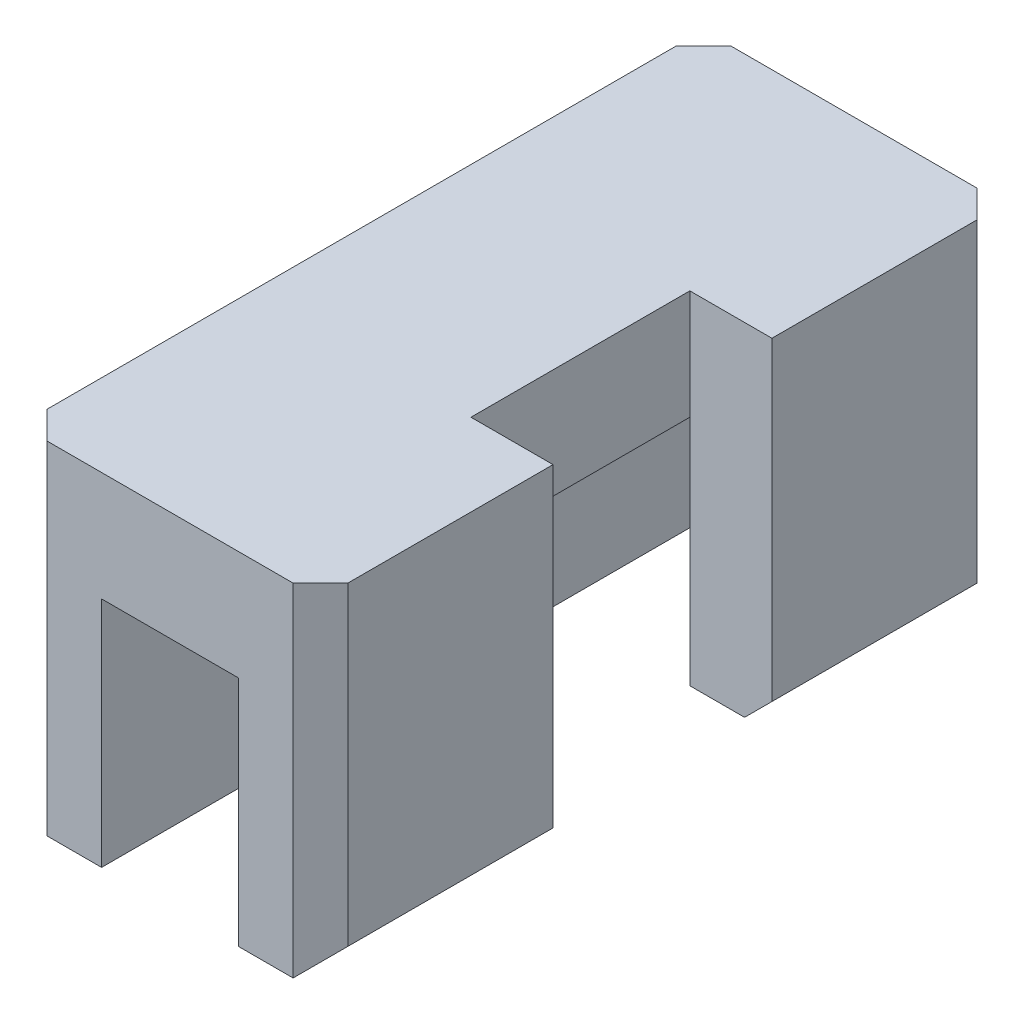
ISO-10303-21;
HEADER;
FILE_DESCRIPTION(('STEP AP214'),'2;1');
FILE_NAME('part.step','',(''),(''),'','','');
FILE_SCHEMA(('AUTOMOTIVE_DESIGN { 1 0 10303 214 1 1 1 1 }'));
ENDSEC;
DATA;
#1=APPLICATION_CONTEXT('core data for automotive mechanical design processes');
#2=APPLICATION_PROTOCOL_DEFINITION('international standard','automotive_design',2000,#1);
#3=PRODUCT_CONTEXT('',#1,'mechanical');
#4=PRODUCT('Part','Part','',(#3));
#5=PRODUCT_RELATED_PRODUCT_CATEGORY('part','',(#4));
#6=PRODUCT_DEFINITION_FORMATION('','',#4);
#7=PRODUCT_DEFINITION_CONTEXT('part definition',#1,'design');
#8=PRODUCT_DEFINITION('design','',#6,#7);
#9=PRODUCT_DEFINITION_SHAPE('','',#8);
#10=(LENGTH_UNIT() NAMED_UNIT(*) SI_UNIT(.MILLI.,.METRE.));
#11=(NAMED_UNIT(*) PLANE_ANGLE_UNIT() SI_UNIT($,.RADIAN.));
#12=(NAMED_UNIT(*) SI_UNIT($,.STERADIAN.) SOLID_ANGLE_UNIT());
#13=UNCERTAINTY_MEASURE_WITH_UNIT(LENGTH_MEASURE(1.E-05),#10,'distance_accuracy_value','');
#14=(GEOMETRIC_REPRESENTATION_CONTEXT(3) GLOBAL_UNCERTAINTY_ASSIGNED_CONTEXT((#13)) GLOBAL_UNIT_ASSIGNED_CONTEXT((#10,
#11,#12)) REPRESENTATION_CONTEXT('',''));
#15=CARTESIAN_POINT('',(0.,0.,0.));
#16=DIRECTION('',(0.,0.,1.));
#17=DIRECTION('',(1.,0.,0.));
#18=AXIS2_PLACEMENT_3D('',#15,#16,#17);
#19=CARTESIAN_POINT('',(5.,-17.,50.));
#20=DIRECTION('',(1.,0.,0.));
#21=DIRECTION('',(0.,1.,0.));
#22=AXIS2_PLACEMENT_3D('',#19,#20,#21);
#23=PLANE('',#22);
#24=DIRECTION('',(0.,0.,-1.));
#25=VECTOR('',#24,1.);
#26=CARTESIAN_POINT('',(5.,-17.,50.));
#27=LINE('',#26,#25);
#28=CARTESIAN_POINT('',(5.00000000000001,-17.,17.));
#29=VERTEX_POINT('',#28);
#30=CARTESIAN_POINT('',(5.,-17.,0.));
#31=VERTEX_POINT('',#30);
#32=EDGE_CURVE('E256',#29,#31,#27,.T.);
#33=ORIENTED_EDGE('',*,*,#32,.F.);
#34=DIRECTION('',(0.,1.,0.));
#35=VECTOR('',#34,1.);
#36=CARTESIAN_POINT('',(5.00000000000001,-17.,17.));
#37=LINE('',#36,#35);
#38=CARTESIAN_POINT('',(5.,0.,17.));
#39=VERTEX_POINT('',#38);
#40=EDGE_CURVE('E177',#29,#39,#37,.T.);
#41=ORIENTED_EDGE('',*,*,#40,.T.);
#42=DIRECTION('',(0.,0.,-1.));
#43=VECTOR('',#42,1.);
#44=CARTESIAN_POINT('',(5.,0.,50.));
#45=LINE('',#44,#43);
#46=CARTESIAN_POINT('',(5.,0.,0.));
#47=VERTEX_POINT('',#46);
#48=EDGE_CURVE('E226',#39,#47,#45,.T.);
#49=ORIENTED_EDGE('',*,*,#48,.T.);
#50=DIRECTION('',(0.,-1.,0.));
#51=VECTOR('',#50,1.);
#52=CARTESIAN_POINT('',(5.,-17.,0.));
#53=LINE('',#52,#51);
#54=EDGE_CURVE('E206',#47,#31,#53,.T.);
#55=ORIENTED_EDGE('',*,*,#54,.T.);
#56=EDGE_LOOP('',(#33,#41,#49,#55));
#57=FACE_BOUND('',#56,.T.);
#58=ADVANCED_FACE('F39',(#57),#23,.F.);
#59=CARTESIAN_POINT('',(11.,-17.,50.));
#60=DIRECTION('',(0.,1.,0.));
#61=DIRECTION('',(-1.,0.,0.));
#62=AXIS2_PLACEMENT_3D('',#59,#60,#61);
#63=PLANE('',#62);
#64=DIRECTION('',(1.,0.,0.));
#65=VECTOR('',#64,1.);
#66=CARTESIAN_POINT('',(11.,-17.,0.));
#67=LINE('',#66,#65);
#68=CARTESIAN_POINT('',(8.99999999999999,-17.,0.));
#69=VERTEX_POINT('',#68);
#70=EDGE_CURVE('E229',#31,#69,#67,.T.);
#71=ORIENTED_EDGE('',*,*,#70,.T.);
#72=DIRECTION('',(0.,0.,1.));
#73=VECTOR('',#72,1.);
#74=CARTESIAN_POINT('',(8.99999999999999,-17.,50.));
#75=LINE('',#74,#73);
#76=CARTESIAN_POINT('',(8.99999999999999,-17.,17.));
#77=VERTEX_POINT('',#76);
#78=EDGE_CURVE('E290',#69,#77,#75,.T.);
#79=ORIENTED_EDGE('',*,*,#78,.T.);
#80=DIRECTION('',(1.,0.,0.));
#81=VECTOR('',#80,1.);
#82=CARTESIAN_POINT('',(5.00000000000001,-17.,17.));
#83=LINE('',#82,#81);
#84=EDGE_CURVE('E204',#29,#77,#83,.T.);
#85=ORIENTED_EDGE('',*,*,#84,.F.);
#86=ORIENTED_EDGE('',*,*,#32,.T.);
#87=EDGE_LOOP('',(#71,#79,#85,#86));
#88=FACE_BOUND('',#87,.T.);
#89=ADVANCED_FACE('F362',(#88),#63,.F.);
#90=CARTESIAN_POINT('',(11.,8.,50.));
#91=DIRECTION('',(-1.,0.,0.));
#92=DIRECTION('',(0.,-1.,0.));
#93=AXIS2_PLACEMENT_3D('',#90,#91,#92);
#94=PLANE('',#93);
#95=DIRECTION('',(0.,0.,-1.));
#96=VECTOR('',#95,1.);
#97=CARTESIAN_POINT('',(11.,-15.,50.));
#98=LINE('',#97,#96);
#99=CARTESIAN_POINT('',(11.,-15.,17.));
#100=VERTEX_POINT('',#99);
#101=CARTESIAN_POINT('',(11.,-15.,2.));
#102=VERTEX_POINT('',#101);
#103=EDGE_CURVE('E285',#100,#102,#98,.T.);
#104=ORIENTED_EDGE('',*,*,#103,.T.);
#105=DIRECTION('',(0.,1.,0.));
#106=VECTOR('',#105,1.);
#107=CARTESIAN_POINT('',(11.,8.,2.));
#108=LINE('',#107,#106);
#109=CARTESIAN_POINT('',(11.,8.,2.));
#110=VERTEX_POINT('',#109);
#111=EDGE_CURVE('E287',#102,#110,#108,.T.);
#112=ORIENTED_EDGE('',*,*,#111,.T.);
#113=DIRECTION('',(0.,0.,-1.));
#114=VECTOR('',#113,1.);
#115=CARTESIAN_POINT('',(11.,8.,50.));
#116=LINE('',#115,#114);
#117=CARTESIAN_POINT('',(11.,8.,17.));
#118=VERTEX_POINT('',#117);
#119=EDGE_CURVE('E253',#118,#110,#116,.T.);
#120=ORIENTED_EDGE('',*,*,#119,.F.);
#121=DIRECTION('',(0.,1.,0.));
#122=VECTOR('',#121,1.);
#123=CARTESIAN_POINT('',(11.,-17.,17.));
#124=LINE('',#123,#122);
#125=EDGE_CURVE('E185',#100,#118,#124,.T.);
#126=ORIENTED_EDGE('',*,*,#125,.F.);
#127=EDGE_LOOP('',(#104,#112,#120,#126));
#128=FACE_BOUND('',#127,.T.);
#129=ADVANCED_FACE('F354',(#128),#94,.F.);
#130=CARTESIAN_POINT('',(5.,0.,50.));
#131=VERTEX_POINT('',#130);
#132=CARTESIAN_POINT('',(5.,0.,33.));
#133=VERTEX_POINT('',#132);
#134=EDGE_CURVE('E241',#131,#133,#45,.T.);
#135=ORIENTED_EDGE('',*,*,#134,.T.);
#136=DIRECTION('',(0.,-1.,0.));
#137=VECTOR('',#136,1.);
#138=CARTESIAN_POINT('',(5.00000000000001,-17.,33.));
#139=LINE('',#138,#137);
#140=CARTESIAN_POINT('',(5.00000000000001,-17.,33.));
#141=VERTEX_POINT('',#140);
#142=EDGE_CURVE('E195',#133,#141,#139,.T.);
#143=ORIENTED_EDGE('',*,*,#142,.T.);
#144=CARTESIAN_POINT('',(5.,-17.,50.));
#145=VERTEX_POINT('',#144);
#146=EDGE_CURVE('E257',#145,#141,#27,.T.);
#147=ORIENTED_EDGE('',*,*,#146,.F.);
#148=DIRECTION('',(0.,-1.,0.));
#149=VECTOR('',#148,1.);
#150=CARTESIAN_POINT('',(5.,-17.,50.));
#151=LINE('',#150,#149);
#152=EDGE_CURVE('E210',#131,#145,#151,.T.);
#153=ORIENTED_EDGE('',*,*,#152,.F.);
#154=EDGE_LOOP('',(#135,#143,#147,#153));
#155=FACE_BOUND('',#154,.T.);
#156=ADVANCED_FACE('F345',(#155),#23,.F.);
#157=DIRECTION('',(1.,0.,0.));
#158=VECTOR('',#157,1.);
#159=CARTESIAN_POINT('',(5.00000000000001,-17.,33.));
#160=LINE('',#159,#158);
#161=CARTESIAN_POINT('',(9.,-17.,33.));
#162=VERTEX_POINT('',#161);
#163=EDGE_CURVE('E207',#141,#162,#160,.T.);
#164=ORIENTED_EDGE('',*,*,#163,.T.);
#165=DIRECTION('',(0.,0.,1.));
#166=VECTOR('',#165,1.);
#167=CARTESIAN_POINT('',(9.,-17.,50.));
#168=LINE('',#167,#166);
#169=CARTESIAN_POINT('',(9.00000000000001,-17.,50.));
#170=VERTEX_POINT('',#169);
#171=EDGE_CURVE('E11',#162,#170,#168,.T.);
#172=ORIENTED_EDGE('',*,*,#171,.T.);
#173=DIRECTION('',(1.,0.,0.));
#174=VECTOR('',#173,1.);
#175=CARTESIAN_POINT('',(11.,-17.,50.));
#176=LINE('',#175,#174);
#177=EDGE_CURVE('E213',#145,#170,#176,.T.);
#178=ORIENTED_EDGE('',*,*,#177,.F.);
#179=ORIENTED_EDGE('',*,*,#146,.T.);
#180=EDGE_LOOP('',(#164,#172,#178,#179));
#181=FACE_BOUND('',#180,.T.);
#182=ADVANCED_FACE('F348',(#181),#63,.F.);
#183=DIRECTION('',(0.,-1.,0.));
#184=VECTOR('',#183,1.);
#185=CARTESIAN_POINT('',(11.,-17.,48.));
#186=LINE('',#185,#184);
#187=CARTESIAN_POINT('',(11.,8.,48.));
#188=VERTEX_POINT('',#187);
#189=CARTESIAN_POINT('',(11.,-15.,48.));
#190=VERTEX_POINT('',#189);
#191=EDGE_CURVE('E64',#188,#190,#186,.T.);
#192=ORIENTED_EDGE('',*,*,#191,.T.);
#193=DIRECTION('',(0.,0.,-1.));
#194=VECTOR('',#193,1.);
#195=CARTESIAN_POINT('',(11.,-15.,50.));
#196=LINE('',#195,#194);
#197=CARTESIAN_POINT('',(11.,-15.,33.));
#198=VERTEX_POINT('',#197);
#199=EDGE_CURVE('E295',#190,#198,#196,.T.);
#200=ORIENTED_EDGE('',*,*,#199,.T.);
#201=DIRECTION('',(0.,-1.,0.));
#202=VECTOR('',#201,1.);
#203=CARTESIAN_POINT('',(11.,-17.,33.));
#204=LINE('',#203,#202);
#205=CARTESIAN_POINT('',(11.,8.,33.));
#206=VERTEX_POINT('',#205);
#207=EDGE_CURVE('E178',#206,#198,#204,.T.);
#208=ORIENTED_EDGE('',*,*,#207,.F.);
#209=EDGE_CURVE('E254',#188,#206,#116,.T.);
#210=ORIENTED_EDGE('',*,*,#209,.F.);
#211=EDGE_LOOP('',(#192,#200,#208,#210));
#212=FACE_BOUND('',#211,.T.);
#213=ADVANCED_FACE('F351',(#212),#94,.F.);
#214=CARTESIAN_POINT('',(-11.,8.,50.));
#215=DIRECTION('',(0.,-1.,0.));
#216=DIRECTION('',(0.,0.,-1.));
#217=AXIS2_PLACEMENT_3D('',#214,#215,#216);
#218=PLANE('',#217);
#219=DIRECTION('',(0.,0.,-1.));
#220=VECTOR('',#219,1.);
#221=CARTESIAN_POINT('',(-11.,8.,50.));
#222=LINE('',#221,#220);
#223=CARTESIAN_POINT('',(-11.,8.,48.));
#224=VERTEX_POINT('',#223);
#225=CARTESIAN_POINT('',(-11.,8.,2.));
#226=VERTEX_POINT('',#225);
#227=EDGE_CURVE('E250',#224,#226,#222,.T.);
#228=ORIENTED_EDGE('',*,*,#227,.F.);
#229=DIRECTION('',(0.707106781186549,0.,0.707106781186546));
#230=VECTOR('',#229,1.);
#231=CARTESIAN_POINT('',(-8.99999999999999,8.,50.));
#232=LINE('',#231,#230);
#233=CARTESIAN_POINT('',(-8.99999999999999,8.,50.));
#234=VERTEX_POINT('',#233);
#235=EDGE_CURVE('E277',#224,#234,#232,.T.);
#236=ORIENTED_EDGE('',*,*,#235,.T.);
#237=DIRECTION('',(-1.,0.,0.));
#238=VECTOR('',#237,1.);
#239=CARTESIAN_POINT('',(-11.,8.,50.));
#240=LINE('',#239,#238);
#241=CARTESIAN_POINT('',(9.,8.,50.));
#242=VERTEX_POINT('',#241);
#243=EDGE_CURVE('E217',#242,#234,#240,.T.);
#244=ORIENTED_EDGE('',*,*,#243,.F.);
#245=DIRECTION('',(0.707106781186546,0.,-0.707106781186549));
#246=VECTOR('',#245,1.);
#247=CARTESIAN_POINT('',(9.,8.,50.));
#248=LINE('',#247,#246);
#249=EDGE_CURVE('E271',#242,#188,#248,.T.);
#250=ORIENTED_EDGE('',*,*,#249,.T.);
#251=ORIENTED_EDGE('',*,*,#209,.T.);
#252=DIRECTION('',(1.,0.,0.));
#253=VECTOR('',#252,1.);
#254=CARTESIAN_POINT('',(5.,8.,33.));
#255=LINE('',#254,#253);
#256=CARTESIAN_POINT('',(5.,8.,33.));
#257=VERTEX_POINT('',#256);
#258=EDGE_CURVE('E189',#257,#206,#255,.T.);
#259=ORIENTED_EDGE('',*,*,#258,.F.);
#260=DIRECTION('',(0.,0.,1.));
#261=VECTOR('',#260,1.);
#262=CARTESIAN_POINT('',(5.,8.,17.));
#263=LINE('',#262,#261);
#264=CARTESIAN_POINT('',(5.,8.,17.));
#265=VERTEX_POINT('',#264);
#266=EDGE_CURVE('E171',#265,#257,#263,.T.);
#267=ORIENTED_EDGE('',*,*,#266,.F.);
#268=DIRECTION('',(1.,0.,0.));
#269=VECTOR('',#268,1.);
#270=CARTESIAN_POINT('',(5.,8.,17.));
#271=LINE('',#270,#269);
#272=EDGE_CURVE('E181',#265,#118,#271,.T.);
#273=ORIENTED_EDGE('',*,*,#272,.T.);
#274=ORIENTED_EDGE('',*,*,#119,.T.);
#275=DIRECTION('',(0.707106781186548,0.,0.707106781186547));
#276=VECTOR('',#275,1.);
#277=CARTESIAN_POINT('',(11.,8.,2.));
#278=LINE('',#277,#276);
#279=CARTESIAN_POINT('',(9.,8.,0.));
#280=VERTEX_POINT('',#279);
#281=EDGE_CURVE('E273',#110,#280,#278,.F.);
#282=ORIENTED_EDGE('',*,*,#281,.T.);
#283=DIRECTION('',(-1.,0.,0.));
#284=VECTOR('',#283,1.);
#285=CARTESIAN_POINT('',(-11.,8.,0.));
#286=LINE('',#285,#284);
#287=CARTESIAN_POINT('',(-8.99999999999999,8.,0.));
#288=VERTEX_POINT('',#287);
#289=EDGE_CURVE('E232',#280,#288,#286,.T.);
#290=ORIENTED_EDGE('',*,*,#289,.T.);
#291=DIRECTION('',(0.707106781186549,0.,-0.707106781186546));
#292=VECTOR('',#291,1.);
#293=CARTESIAN_POINT('',(-11.,8.,2.));
#294=LINE('',#293,#292);
#295=EDGE_CURVE('E275',#288,#226,#294,.F.);
#296=ORIENTED_EDGE('',*,*,#295,.T.);
#297=EDGE_LOOP('',(#228,#236,#244,#250,#251,#259,#267,#273,#274,#282,#290,#296));
#298=FACE_BOUND('',#297,.T.);
#299=ADVANCED_FACE('F193',(#298),#218,.F.);
#300=CARTESIAN_POINT('',(-11.,-17.,50.));
#301=DIRECTION('',(1.,0.,0.));
#302=DIRECTION('',(0.,1.,0.));
#303=AXIS2_PLACEMENT_3D('',#300,#301,#302);
#304=PLANE('',#303);
#305=CARTESIAN_POINT('',(-11.,-5.49999999999997,25.));
#306=DIRECTION('',(1.,0.,0.));
#307=DIRECTION('',(0.,1.,0.));
#308=AXIS2_PLACEMENT_3D('',#305,#306,#307);
#309=CIRCLE('',#308,2.25);
#310=CARTESIAN_POINT('',(-11.,-3.24999999999998,25.));
#311=VERTEX_POINT('',#310);
#312=EDGE_CURVE('E202',#311,#311,#309,.T.);
#313=ORIENTED_EDGE('',*,*,#312,.T.);
#314=EDGE_LOOP('',(#313));
#315=FACE_BOUND('',#314,.T.);
#316=DIRECTION('',(0.,0.,1.));
#317=VECTOR('',#316,1.);
#318=CARTESIAN_POINT('',(-11.,-15.,50.));
#319=LINE('',#318,#317);
#320=CARTESIAN_POINT('',(-11.,-15.,2.));
#321=VERTEX_POINT('',#320);
#322=CARTESIAN_POINT('',(-11.,-15.,48.));
#323=VERTEX_POINT('',#322);
#324=EDGE_CURVE('E267',#321,#323,#319,.T.);
#325=ORIENTED_EDGE('',*,*,#324,.T.);
#326=DIRECTION('',(0.,1.,0.));
#327=VECTOR('',#326,1.);
#328=CARTESIAN_POINT('',(-11.,8.,48.));
#329=LINE('',#328,#327);
#330=EDGE_CURVE('E269',#323,#224,#329,.T.);
#331=ORIENTED_EDGE('',*,*,#330,.T.);
#332=ORIENTED_EDGE('',*,*,#227,.T.);
#333=DIRECTION('',(0.,-1.,0.));
#334=VECTOR('',#333,1.);
#335=CARTESIAN_POINT('',(-11.,-17.,2.));
#336=LINE('',#335,#334);
#337=EDGE_CURVE('E265',#226,#321,#336,.T.);
#338=ORIENTED_EDGE('',*,*,#337,.T.);
#339=EDGE_LOOP('',(#325,#331,#332,#338));
#340=FACE_BOUND('',#339,.T.);
#341=ADVANCED_FACE('F359',(#315,#340),#304,.F.);
#342=CARTESIAN_POINT('',(-5.,-17.,50.));
#343=DIRECTION('',(0.,1.,0.));
#344=DIRECTION('',(-1.,0.,0.));
#345=AXIS2_PLACEMENT_3D('',#342,#343,#344);
#346=PLANE('',#345);
#347=DIRECTION('',(1.,0.,0.));
#348=VECTOR('',#347,1.);
#349=CARTESIAN_POINT('',(-5.,-17.,50.));
#350=LINE('',#349,#348);
#351=CARTESIAN_POINT('',(-8.99999999999999,-17.,50.));
#352=VERTEX_POINT('',#351);
#353=CARTESIAN_POINT('',(-5.,-17.,50.));
#354=VERTEX_POINT('',#353);
#355=EDGE_CURVE('E220',#352,#354,#350,.T.);
#356=ORIENTED_EDGE('',*,*,#355,.F.);
#357=DIRECTION('',(0.,0.,-1.));
#358=VECTOR('',#357,1.);
#359=CARTESIAN_POINT('',(-8.99999999999999,-17.,50.));
#360=LINE('',#359,#358);
#361=CARTESIAN_POINT('',(-8.99999999999999,-17.,0.));
#362=VERTEX_POINT('',#361);
#363=EDGE_CURVE('E279',#352,#362,#360,.T.);
#364=ORIENTED_EDGE('',*,*,#363,.T.);
#365=DIRECTION('',(1.,0.,0.));
#366=VECTOR('',#365,1.);
#367=CARTESIAN_POINT('',(-5.,-17.,0.));
#368=LINE('',#367,#366);
#369=CARTESIAN_POINT('',(-5.,-17.,0.));
#370=VERTEX_POINT('',#369);
#371=EDGE_CURVE('E235',#362,#370,#368,.T.);
#372=ORIENTED_EDGE('',*,*,#371,.T.);
#373=DIRECTION('',(0.,0.,-1.));
#374=VECTOR('',#373,1.);
#375=CARTESIAN_POINT('',(-5.,-17.,50.));
#376=LINE('',#375,#374);
#377=EDGE_CURVE('E247',#354,#370,#376,.T.);
#378=ORIENTED_EDGE('',*,*,#377,.F.);
#379=EDGE_LOOP('',(#356,#364,#372,#378));
#380=FACE_BOUND('',#379,.T.);
#381=ADVANCED_FACE('F330',(#380),#346,.F.);
#382=CARTESIAN_POINT('',(-5.,0.,50.));
#383=DIRECTION('',(-1.,0.,0.));
#384=DIRECTION('',(0.,-1.,0.));
#385=AXIS2_PLACEMENT_3D('',#382,#383,#384);
#386=PLANE('',#385);
#387=CARTESIAN_POINT('',(-5.,-5.49999999999998,25.));
#388=DIRECTION('',(1.,0.,0.));
#389=DIRECTION('',(0.,1.,0.));
#390=AXIS2_PLACEMENT_3D('',#387,#388,#389);
#391=CIRCLE('',#390,2.25);
#392=CARTESIAN_POINT('',(-5.,-3.24999999999998,25.));
#393=VERTEX_POINT('',#392);
#394=EDGE_CURVE('E303',#393,#393,#391,.T.);
#395=ORIENTED_EDGE('',*,*,#394,.F.);
#396=EDGE_LOOP('',(#395));
#397=FACE_BOUND('',#396,.T.);
#398=DIRECTION('',(0.,1.,0.));
#399=VECTOR('',#398,1.);
#400=CARTESIAN_POINT('',(-5.,0.,0.));
#401=LINE('',#400,#399);
#402=CARTESIAN_POINT('',(-5.,0.,0.));
#403=VERTEX_POINT('',#402);
#404=EDGE_CURVE('E237',#370,#403,#401,.T.);
#405=ORIENTED_EDGE('',*,*,#404,.T.);
#406=DIRECTION('',(0.,0.,-1.));
#407=VECTOR('',#406,1.);
#408=CARTESIAN_POINT('',(-5.,0.,50.));
#409=LINE('',#408,#407);
#410=CARTESIAN_POINT('',(-5.,0.,50.));
#411=VERTEX_POINT('',#410);
#412=EDGE_CURVE('E244',#411,#403,#409,.T.);
#413=ORIENTED_EDGE('',*,*,#412,.F.);
#414=DIRECTION('',(0.,1.,0.));
#415=VECTOR('',#414,1.);
#416=CARTESIAN_POINT('',(-5.,0.,50.));
#417=LINE('',#416,#415);
#418=EDGE_CURVE('E222',#354,#411,#417,.T.);
#419=ORIENTED_EDGE('',*,*,#418,.F.);
#420=ORIENTED_EDGE('',*,*,#377,.T.);
#421=EDGE_LOOP('',(#405,#413,#419,#420));
#422=FACE_BOUND('',#421,.T.);
#423=ADVANCED_FACE('F336',(#397,#422),#386,.F.);
#424=CARTESIAN_POINT('',(5.,0.,50.));
#425=DIRECTION('',(0.,1.,0.));
#426=DIRECTION('',(-1.,0.,0.));
#427=AXIS2_PLACEMENT_3D('',#424,#425,#426);
#428=PLANE('',#427);
#429=DIRECTION('',(1.,0.,0.));
#430=VECTOR('',#429,1.);
#431=CARTESIAN_POINT('',(5.,0.,0.));
#432=LINE('',#431,#430);
#433=EDGE_CURVE('E214',#403,#47,#432,.T.);
#434=ORIENTED_EDGE('',*,*,#433,.T.);
#435=ORIENTED_EDGE('',*,*,#48,.F.);
#436=EDGE_CURVE('E174',#133,#39,#45,.T.);
#437=ORIENTED_EDGE('',*,*,#436,.F.);
#438=ORIENTED_EDGE('',*,*,#134,.F.);
#439=DIRECTION('',(1.,0.,0.));
#440=VECTOR('',#439,1.);
#441=CARTESIAN_POINT('',(5.,0.,50.));
#442=LINE('',#441,#440);
#443=EDGE_CURVE('E224',#411,#131,#442,.T.);
#444=ORIENTED_EDGE('',*,*,#443,.F.);
#445=ORIENTED_EDGE('',*,*,#412,.T.);
#446=EDGE_LOOP('',(#434,#435,#437,#438,#444,#445));
#447=FACE_BOUND('',#446,.T.);
#448=ADVANCED_FACE('F342',(#447),#428,.F.);
#449=CARTESIAN_POINT('',(0.,0.,50.));
#450=DIRECTION('',(0.,0.,1.));
#451=DIRECTION('',(1.,0.,0.));
#452=AXIS2_PLACEMENT_3D('',#449,#450,#451);
#453=PLANE('',#452);
#454=ORIENTED_EDGE('',*,*,#243,.T.);
#455=DIRECTION('',(0.,-1.,0.));
#456=VECTOR('',#455,1.);
#457=CARTESIAN_POINT('',(-8.99999999999999,-17.,50.));
#458=LINE('',#457,#456);
#459=EDGE_CURVE('E262',#234,#352,#458,.T.);
#460=ORIENTED_EDGE('',*,*,#459,.T.);
#461=ORIENTED_EDGE('',*,*,#355,.T.);
#462=ORIENTED_EDGE('',*,*,#418,.T.);
#463=ORIENTED_EDGE('',*,*,#443,.T.);
#464=ORIENTED_EDGE('',*,*,#152,.T.);
#465=ORIENTED_EDGE('',*,*,#177,.T.);
#466=DIRECTION('',(0.,1.,0.));
#467=VECTOR('',#466,1.);
#468=CARTESIAN_POINT('',(9.,8.,50.));
#469=LINE('',#468,#467);
#470=EDGE_CURVE('E260',#170,#242,#469,.T.);
#471=ORIENTED_EDGE('',*,*,#470,.T.);
#472=EDGE_LOOP('',(#454,#460,#461,#462,#463,#464,#465,#471));
#473=FACE_BOUND('',#472,.T.);
#474=ADVANCED_FACE('F319',(#473),#453,.T.);
#475=CARTESIAN_POINT('',(0.,0.,0.));
#476=DIRECTION('',(0.,0.,1.));
#477=DIRECTION('',(1.,0.,0.));
#478=AXIS2_PLACEMENT_3D('',#475,#476,#477);
#479=PLANE('',#478);
#480=ORIENTED_EDGE('',*,*,#371,.F.);
#481=DIRECTION('',(0.,1.,0.));
#482=VECTOR('',#481,1.);
#483=CARTESIAN_POINT('',(-8.99999999999999,0.,0.));
#484=LINE('',#483,#482);
#485=EDGE_CURVE('E283',#362,#288,#484,.T.);
#486=ORIENTED_EDGE('',*,*,#485,.T.);
#487=ORIENTED_EDGE('',*,*,#289,.F.);
#488=DIRECTION('',(0.,-1.,0.));
#489=VECTOR('',#488,1.);
#490=CARTESIAN_POINT('',(9.,0.,0.));
#491=LINE('',#490,#489);
#492=EDGE_CURVE('E281',#280,#69,#491,.T.);
#493=ORIENTED_EDGE('',*,*,#492,.T.);
#494=ORIENTED_EDGE('',*,*,#70,.F.);
#495=ORIENTED_EDGE('',*,*,#54,.F.);
#496=ORIENTED_EDGE('',*,*,#433,.F.);
#497=ORIENTED_EDGE('',*,*,#404,.F.);
#498=EDGE_LOOP('',(#480,#486,#487,#493,#494,#495,#496,#497));
#499=FACE_BOUND('',#498,.T.);
#500=ADVANCED_FACE('F441',(#499),#479,.F.);
#501=CARTESIAN_POINT('',(5.,0.,0.));
#502=DIRECTION('',(1.,0.,0.));
#503=DIRECTION('',(0.,1.,0.));
#504=AXIS2_PLACEMENT_3D('',#501,#502,#503);
#505=PLANE('',#504);
#506=ORIENTED_EDGE('',*,*,#436,.T.);
#507=EDGE_CURVE('E167',#39,#265,#37,.T.);
#508=ORIENTED_EDGE('',*,*,#507,.T.);
#509=ORIENTED_EDGE('',*,*,#266,.T.);
#510=EDGE_CURVE('E190',#257,#133,#139,.T.);
#511=ORIENTED_EDGE('',*,*,#510,.T.);
#512=EDGE_LOOP('',(#506,#508,#509,#511));
#513=FACE_BOUND('',#512,.T.);
#514=ADVANCED_FACE('F169',(#513),#505,.T.);
#515=CARTESIAN_POINT('',(5.00000000000001,-17.,17.));
#516=DIRECTION('',(0.,0.,-1.));
#517=DIRECTION('',(-1.,0.,0.));
#518=AXIS2_PLACEMENT_3D('',#515,#516,#517);
#519=PLANE('',#518);
#520=ORIENTED_EDGE('',*,*,#84,.T.);
#521=DIRECTION('',(-0.707106781186549,-0.707106781186546,0.));
#522=VECTOR('',#521,1.);
#523=CARTESIAN_POINT('',(11.,-15.,17.));
#524=LINE('',#523,#522);
#525=EDGE_CURVE('E292',#77,#100,#524,.F.);
#526=ORIENTED_EDGE('',*,*,#525,.T.);
#527=ORIENTED_EDGE('',*,*,#125,.T.);
#528=ORIENTED_EDGE('',*,*,#272,.F.);
#529=ORIENTED_EDGE('',*,*,#507,.F.);
#530=ORIENTED_EDGE('',*,*,#40,.F.);
#531=EDGE_LOOP('',(#520,#526,#527,#528,#529,#530));
#532=FACE_BOUND('',#531,.T.);
#533=ADVANCED_FACE('F183',(#532),#519,.F.);
#534=CARTESIAN_POINT('',(5.00000000000001,-17.,33.));
#535=DIRECTION('',(0.,0.,1.));
#536=DIRECTION('',(1.,0.,0.));
#537=AXIS2_PLACEMENT_3D('',#534,#535,#536);
#538=PLANE('',#537);
#539=ORIENTED_EDGE('',*,*,#207,.T.);
#540=DIRECTION('',(0.707106781186547,0.707106781186548,0.));
#541=VECTOR('',#540,1.);
#542=CARTESIAN_POINT('',(11.,-15.,33.));
#543=LINE('',#542,#541);
#544=EDGE_CURVE('E49',#198,#162,#543,.F.);
#545=ORIENTED_EDGE('',*,*,#544,.T.);
#546=ORIENTED_EDGE('',*,*,#163,.F.);
#547=ORIENTED_EDGE('',*,*,#142,.F.);
#548=ORIENTED_EDGE('',*,*,#510,.F.);
#549=ORIENTED_EDGE('',*,*,#258,.T.);
#550=EDGE_LOOP('',(#539,#545,#546,#547,#548,#549));
#551=FACE_BOUND('',#550,.T.);
#552=ADVANCED_FACE('F349',(#551),#538,.F.);
#553=CARTESIAN_POINT('',(-15.,-5.49999999999997,25.));
#554=DIRECTION('',(1.,0.,0.));
#555=DIRECTION('',(0.,1.,0.));
#556=AXIS2_PLACEMENT_3D('',#553,#554,#555);
#557=CYLINDRICAL_SURFACE('',#556,2.25);
#558=ORIENTED_EDGE('',*,*,#394,.T.);
#559=EDGE_LOOP('',(#558));
#560=FACE_BOUND('',#559,.T.);
#561=ORIENTED_EDGE('',*,*,#312,.F.);
#562=EDGE_LOOP('',(#561));
#563=FACE_BOUND('',#562,.T.);
#564=ADVANCED_FACE('F476',(#560,#563),#557,.F.);
#565=CARTESIAN_POINT('',(-11.,-17.,2.));
#566=DIRECTION('',(0.707106781186546,0.,0.707106781186549));
#567=DIRECTION('',(0.,-1.,0.));
#568=AXIS2_PLACEMENT_3D('',#565,#566,#567);
#569=PLANE('',#568);
#570=ORIENTED_EDGE('',*,*,#295,.F.);
#571=ORIENTED_EDGE('',*,*,#485,.F.);
#572=DIRECTION('',(-0.577350269189628,0.577350269189624,0.577350269189625));
#573=VECTOR('',#572,1.);
#574=CARTESIAN_POINT('',(-10.3333333333333,-15.6666666666667,1.33333333333334));
#575=LINE('',#574,#573);
#576=EDGE_CURVE('E300',#321,#362,#575,.F.);
#577=ORIENTED_EDGE('',*,*,#576,.F.);
#578=ORIENTED_EDGE('',*,*,#337,.F.);
#579=EDGE_LOOP('',(#570,#571,#577,#578));
#580=FACE_BOUND('',#579,.T.);
#581=ADVANCED_FACE('F486',(#580),#569,.F.);
#582=CARTESIAN_POINT('',(-8.99999999999999,-17.,50.));
#583=DIRECTION('',(0.707106781186545,0.70710678118655,0.));
#584=DIRECTION('',(0.,0.,-1.));
#585=AXIS2_PLACEMENT_3D('',#582,#583,#584);
#586=PLANE('',#585);
#587=ORIENTED_EDGE('',*,*,#576,.T.);
#588=ORIENTED_EDGE('',*,*,#363,.F.);
#589=DIRECTION('',(0.577350269189628,-0.577350269189624,0.577350269189625));
#590=VECTOR('',#589,1.);
#591=CARTESIAN_POINT('',(-8.99999999999999,-17.,50.));
#592=LINE('',#591,#590);
#593=EDGE_CURVE('E298',#323,#352,#592,.T.);
#594=ORIENTED_EDGE('',*,*,#593,.F.);
#595=ORIENTED_EDGE('',*,*,#324,.F.);
#596=EDGE_LOOP('',(#587,#588,#594,#595));
#597=FACE_BOUND('',#596,.T.);
#598=ADVANCED_FACE('F492',(#597),#586,.F.);
#599=CARTESIAN_POINT('',(-8.99999999999999,0.,50.));
#600=DIRECTION('',(-0.707106781186546,0.,0.707106781186549));
#601=DIRECTION('',(0.,1.,0.));
#602=AXIS2_PLACEMENT_3D('',#599,#600,#601);
#603=PLANE('',#602);
#604=ORIENTED_EDGE('',*,*,#235,.F.);
#605=ORIENTED_EDGE('',*,*,#330,.F.);
#606=ORIENTED_EDGE('',*,*,#593,.T.);
#607=ORIENTED_EDGE('',*,*,#459,.F.);
#608=EDGE_LOOP('',(#604,#605,#606,#607));
#609=FACE_BOUND('',#608,.T.);
#610=ADVANCED_FACE('F324',(#609),#603,.T.);
#611=CARTESIAN_POINT('',(11.,-15.,50.));
#612=DIRECTION('',(-0.707106781186546,0.707106781186549,0.));
#613=DIRECTION('',(0.,0.,-1.));
#614=AXIS2_PLACEMENT_3D('',#611,#612,#613);
#615=PLANE('',#614);
#616=ORIENTED_EDGE('',*,*,#525,.F.);
#617=ORIENTED_EDGE('',*,*,#78,.F.);
#618=DIRECTION('',(0.577350269189627,0.577350269189624,0.577350269189626));
#619=VECTOR('',#618,1.);
#620=CARTESIAN_POINT('',(27.,0.999999999999963,18.));
#621=LINE('',#620,#619);
#622=EDGE_CURVE('E301',#102,#69,#621,.F.);
#623=ORIENTED_EDGE('',*,*,#622,.F.);
#624=ORIENTED_EDGE('',*,*,#103,.F.);
#625=EDGE_LOOP('',(#616,#617,#623,#624));
#626=FACE_BOUND('',#625,.T.);
#627=ADVANCED_FACE('F507',(#626),#615,.F.);
#628=CARTESIAN_POINT('',(11.,8.,2.));
#629=DIRECTION('',(-0.707106781186547,0.,0.707106781186548));
#630=DIRECTION('',(0.,1.,0.));
#631=AXIS2_PLACEMENT_3D('',#628,#629,#630);
#632=PLANE('',#631);
#633=ORIENTED_EDGE('',*,*,#622,.T.);
#634=ORIENTED_EDGE('',*,*,#492,.F.);
#635=ORIENTED_EDGE('',*,*,#281,.F.);
#636=ORIENTED_EDGE('',*,*,#111,.F.);
#637=EDGE_LOOP('',(#633,#634,#635,#636));
#638=FACE_BOUND('',#637,.T.);
#639=ADVANCED_FACE('F513',(#638),#632,.F.);
#640=CARTESIAN_POINT('',(9.,0.,50.));
#641=DIRECTION('',(0.707106781186549,0.,0.707106781186546));
#642=DIRECTION('',(0.,-1.,0.));
#643=AXIS2_PLACEMENT_3D('',#640,#641,#642);
#644=PLANE('',#643);
#645=ORIENTED_EDGE('',*,*,#249,.F.);
#646=ORIENTED_EDGE('',*,*,#470,.F.);
#647=DIRECTION('',(-0.577350269189625,-0.577350269189625,0.577350269189627));
#648=VECTOR('',#647,1.);
#649=CARTESIAN_POINT('',(14.6666666666667,-11.3333333333333,44.3333333333333));
#650=LINE('',#649,#648);
#651=EDGE_CURVE('E44',#190,#170,#650,.T.);
#652=ORIENTED_EDGE('',*,*,#651,.F.);
#653=ORIENTED_EDGE('',*,*,#191,.F.);
#654=EDGE_LOOP('',(#645,#646,#652,#653));
#655=FACE_BOUND('',#654,.T.);
#656=ADVANCED_FACE('F42',(#655),#644,.T.);
#657=CARTESIAN_POINT('',(11.,-15.,50.));
#658=DIRECTION('',(-0.707106781186548,0.707106781186547,0.));
#659=DIRECTION('',(0.,0.,-1.));
#660=AXIS2_PLACEMENT_3D('',#657,#658,#659);
#661=PLANE('',#660);
#662=ORIENTED_EDGE('',*,*,#651,.T.);
#663=ORIENTED_EDGE('',*,*,#171,.F.);
#664=ORIENTED_EDGE('',*,*,#544,.F.);
#665=ORIENTED_EDGE('',*,*,#199,.F.);
#666=EDGE_LOOP('',(#662,#663,#664,#665));
#667=FACE_BOUND('',#666,.T.);
#668=ADVANCED_FACE('F313',(#667),#661,.F.);
#669=CLOSED_SHELL('',(#58,#89,#129,#156,#182,#213,#299,#341,#381,#423,#448,#474,#500,#514,#533,
#552,#564,#581,#598,#610,#627,#639,#656,#668));
#670=MANIFOLD_SOLID_BREP('B2',#669);
#671=ADVANCED_BREP_SHAPE_REPRESENTATION('',(#18,#670),#14);
#672=SHAPE_DEFINITION_REPRESENTATION(#9,#671);
ENDSEC;
END-ISO-10303-21;
